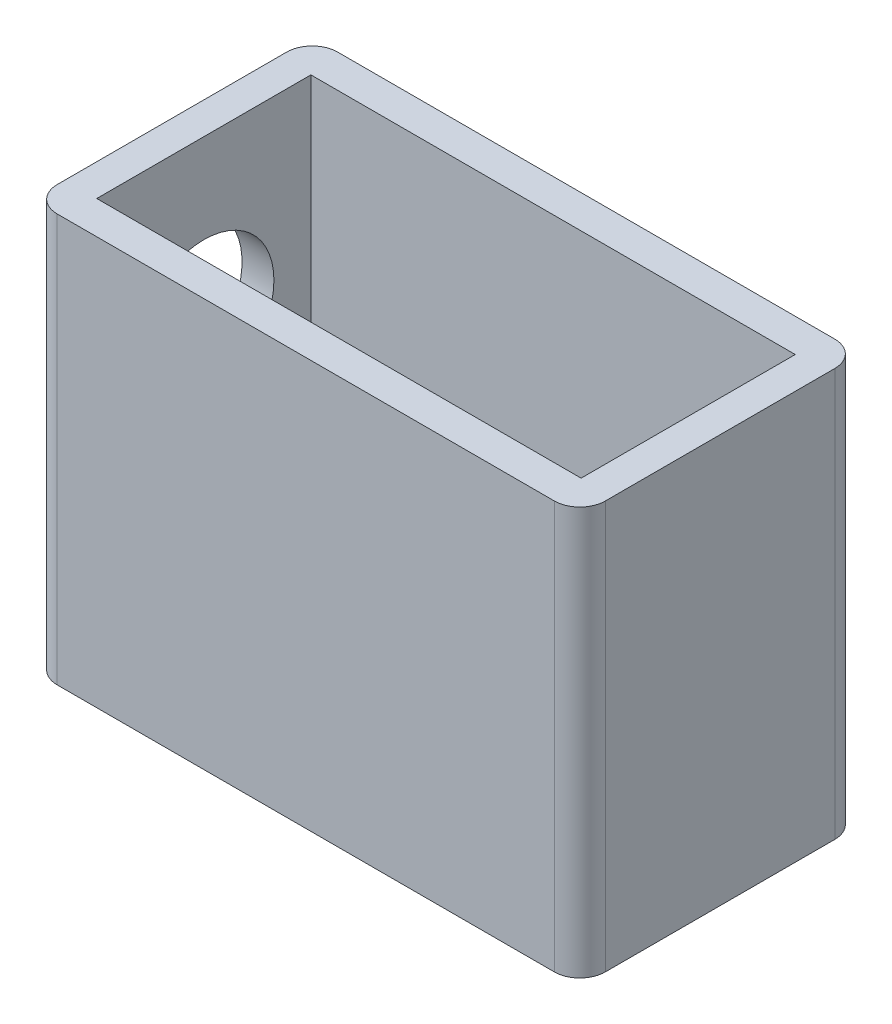
ISO-10303-21;
HEADER;
FILE_DESCRIPTION(('STEP AP214'),'2;1');
FILE_NAME('part.step','',(''),(''),'','','');
FILE_SCHEMA(('AUTOMOTIVE_DESIGN { 1 0 10303 214 1 1 1 1 }'));
ENDSEC;
DATA;
#1=APPLICATION_CONTEXT('core data for automotive mechanical design processes');
#2=APPLICATION_PROTOCOL_DEFINITION('international standard','automotive_design',2000,#1);
#3=PRODUCT_CONTEXT('',#1,'mechanical');
#4=PRODUCT('Part','Part','',(#3));
#5=PRODUCT_RELATED_PRODUCT_CATEGORY('part','',(#4));
#6=PRODUCT_DEFINITION_FORMATION('','',#4);
#7=PRODUCT_DEFINITION_CONTEXT('part definition',#1,'design');
#8=PRODUCT_DEFINITION('design','',#6,#7);
#9=PRODUCT_DEFINITION_SHAPE('','',#8);
#10=(LENGTH_UNIT() NAMED_UNIT(*) SI_UNIT(.MILLI.,.METRE.));
#11=(NAMED_UNIT(*) PLANE_ANGLE_UNIT() SI_UNIT($,.RADIAN.));
#12=(NAMED_UNIT(*) SI_UNIT($,.STERADIAN.) SOLID_ANGLE_UNIT());
#13=UNCERTAINTY_MEASURE_WITH_UNIT(LENGTH_MEASURE(1.E-05),#10,'distance_accuracy_value','');
#14=(GEOMETRIC_REPRESENTATION_CONTEXT(3) GLOBAL_UNCERTAINTY_ASSIGNED_CONTEXT((#13)) GLOBAL_UNIT_ASSIGNED_CONTEXT((#10,
#11,#12)) REPRESENTATION_CONTEXT('',''));
#15=CARTESIAN_POINT('',(0.,0.,0.));
#16=DIRECTION('',(0.,0.,1.));
#17=DIRECTION('',(1.,0.,0.));
#18=AXIS2_PLACEMENT_3D('',#15,#16,#17);
#19=CARTESIAN_POINT('',(-17.8,0.6,-7.2));
#20=DIRECTION('',(-1.,0.,0.));
#21=DIRECTION('',(0.,0.,1.));
#22=AXIS2_PLACEMENT_3D('',#19,#20,#21);
#23=PLANE('',#22);
#24=DIRECTION('',(0.,0.,1.));
#25=VECTOR('',#24,1.);
#26=CARTESIAN_POINT('',(-17.8,2.,-7.2));
#27=LINE('',#26,#25);
#28=CARTESIAN_POINT('',(-17.8,2.,-7.2));
#29=VERTEX_POINT('',#28);
#30=CARTESIAN_POINT('',(-17.8,2.,8.));
#31=VERTEX_POINT('',#30);
#32=EDGE_CURVE('E429',#29,#31,#27,.T.);
#33=ORIENTED_EDGE('',*,*,#32,.T.);
#34=DIRECTION('',(0.,1.,0.));
#35=VECTOR('',#34,1.);
#36=CARTESIAN_POINT('',(-17.8,0.6,8.));
#37=LINE('',#36,#35);
#38=CARTESIAN_POINT('',(-17.8,0.6,8.));
#39=VERTEX_POINT('',#38);
#40=EDGE_CURVE('E428',#39,#31,#37,.T.);
#41=ORIENTED_EDGE('',*,*,#40,.F.);
#42=DIRECTION('',(0.,0.,1.));
#43=VECTOR('',#42,1.);
#44=CARTESIAN_POINT('',(-17.8,0.6,-7.2));
#45=LINE('',#44,#43);
#46=CARTESIAN_POINT('',(-17.8,0.6,-7.2));
#47=VERTEX_POINT('',#46);
#48=EDGE_CURVE('E411',#47,#39,#45,.T.);
#49=ORIENTED_EDGE('',*,*,#48,.F.);
#50=DIRECTION('',(0.,1.,0.));
#51=VECTOR('',#50,1.);
#52=CARTESIAN_POINT('',(-17.8,0.6,-7.2));
#53=LINE('',#52,#51);
#54=EDGE_CURVE('E440',#47,#29,#53,.T.);
#55=ORIENTED_EDGE('',*,*,#54,.T.);
#56=EDGE_LOOP('',(#33,#41,#49,#55));
#57=FACE_BOUND('',#56,.T.);
#58=ADVANCED_FACE('F48',(#57),#23,.F.);
#59=CARTESIAN_POINT('',(-17.8,0.6,8.));
#60=DIRECTION('',(0.,0.,1.));
#61=DIRECTION('',(1.,0.,0.));
#62=AXIS2_PLACEMENT_3D('',#59,#60,#61);
#63=PLANE('',#62);
#64=DIRECTION('',(-1.,0.,0.));
#65=VECTOR('',#64,1.);
#66=CARTESIAN_POINT('',(-17.8,2.,8.));
#67=LINE('',#66,#65);
#68=CARTESIAN_POINT('',(17.8,2.,7.99999999999999));
#69=VERTEX_POINT('',#68);
#70=CARTESIAN_POINT('',(2.00000000000001,2.,8.));
#71=VERTEX_POINT('',#70);
#72=EDGE_CURVE('E257',#69,#71,#67,.T.);
#73=ORIENTED_EDGE('',*,*,#72,.F.);
#74=DIRECTION('',(0.,1.,0.));
#75=VECTOR('',#74,1.);
#76=CARTESIAN_POINT('',(17.8,0.6,8.));
#77=LINE('',#76,#75);
#78=CARTESIAN_POINT('',(17.8,0.6,8.));
#79=VERTEX_POINT('',#78);
#80=EDGE_CURVE('E459',#79,#69,#77,.T.);
#81=ORIENTED_EDGE('',*,*,#80,.F.);
#82=DIRECTION('',(1.,0.,0.));
#83=VECTOR('',#82,1.);
#84=CARTESIAN_POINT('',(2.00000000000001,0.6,8.));
#85=LINE('',#84,#83);
#86=CARTESIAN_POINT('',(2.00000000000001,0.6,8.));
#87=VERTEX_POINT('',#86);
#88=EDGE_CURVE('E487',#87,#79,#85,.T.);
#89=ORIENTED_EDGE('',*,*,#88,.F.);
#90=DIRECTION('',(0.,1.,0.));
#91=VECTOR('',#90,1.);
#92=CARTESIAN_POINT('',(2.00000000000001,0.6,8.));
#93=LINE('',#92,#91);
#94=EDGE_CURVE('E454',#87,#71,#93,.T.);
#95=ORIENTED_EDGE('',*,*,#94,.T.);
#96=EDGE_LOOP('',(#73,#81,#89,#95));
#97=FACE_BOUND('',#96,.T.);
#98=ADVANCED_FACE('F584',(#97),#63,.F.);
#99=CARTESIAN_POINT('',(1.00000000000001,2.,8.));
#100=VERTEX_POINT('',#99);
#101=EDGE_CURVE('E291',#100,#31,#67,.T.);
#102=ORIENTED_EDGE('',*,*,#101,.F.);
#103=DIRECTION('',(0.,1.,0.));
#104=VECTOR('',#103,1.);
#105=CARTESIAN_POINT('',(1.00000000000001,0.6,8.));
#106=LINE('',#105,#104);
#107=CARTESIAN_POINT('',(1.00000000000001,0.6,8.));
#108=VERTEX_POINT('',#107);
#109=EDGE_CURVE('E447',#108,#100,#106,.T.);
#110=ORIENTED_EDGE('',*,*,#109,.F.);
#111=DIRECTION('',(1.,0.,0.));
#112=VECTOR('',#111,1.);
#113=CARTESIAN_POINT('',(-17.8,0.6,8.));
#114=LINE('',#113,#112);
#115=EDGE_CURVE('E415',#39,#108,#114,.T.);
#116=ORIENTED_EDGE('',*,*,#115,.F.);
#117=ORIENTED_EDGE('',*,*,#40,.T.);
#118=EDGE_LOOP('',(#102,#110,#116,#117));
#119=FACE_BOUND('',#118,.T.);
#120=ADVANCED_FACE('F591',(#119),#63,.F.);
#121=CARTESIAN_POINT('',(0.,32.,0.));
#122=DIRECTION('',(0.,1.,0.));
#123=DIRECTION('',(0.,0.,1.));
#124=AXIS2_PLACEMENT_3D('',#121,#122,#123);
#125=PLANE('',#124);
#126=DIRECTION('',(0.,0.,-1.));
#127=VECTOR('',#126,1.);
#128=CARTESIAN_POINT('',(21.5,32.,0.));
#129=LINE('',#128,#127);
#130=CARTESIAN_POINT('',(21.5,32.,8.99999999999999));
#131=VERTEX_POINT('',#130);
#132=CARTESIAN_POINT('',(21.5,32.,-9.00000000000001));
#133=VERTEX_POINT('',#132);
#134=EDGE_CURVE('E292',#131,#133,#129,.T.);
#135=ORIENTED_EDGE('',*,*,#134,.T.);
#136=CARTESIAN_POINT('',(19.5,32.,-9.00000000000001));
#137=DIRECTION('',(0.,1.,0.));
#138=DIRECTION('',(0.,0.,1.));
#139=AXIS2_PLACEMENT_3D('',#136,#137,#138);
#140=CIRCLE('',#139,2.);
#141=CARTESIAN_POINT('',(19.5,32.,-11.));
#142=VERTEX_POINT('',#141);
#143=EDGE_CURVE('E296',#133,#142,#140,.T.);
#144=ORIENTED_EDGE('',*,*,#143,.T.);
#145=DIRECTION('',(-1.,0.,0.));
#146=VECTOR('',#145,1.);
#147=CARTESIAN_POINT('',(0.,32.,-11.));
#148=LINE('',#147,#146);
#149=CARTESIAN_POINT('',(-19.5,32.,-11.));
#150=VERTEX_POINT('',#149);
#151=EDGE_CURVE('E300',#142,#150,#148,.T.);
#152=ORIENTED_EDGE('',*,*,#151,.T.);
#153=CARTESIAN_POINT('',(-19.5,32.,-9.));
#154=DIRECTION('',(0.,1.,0.));
#155=DIRECTION('',(0.,0.,1.));
#156=AXIS2_PLACEMENT_3D('',#153,#154,#155);
#157=CIRCLE('',#156,2.);
#158=CARTESIAN_POINT('',(-21.5,32.,-9.));
#159=VERTEX_POINT('',#158);
#160=EDGE_CURVE('E304',#150,#159,#157,.T.);
#161=ORIENTED_EDGE('',*,*,#160,.T.);
#162=DIRECTION('',(0.,0.,1.));
#163=VECTOR('',#162,1.);
#164=CARTESIAN_POINT('',(-21.5,32.,0.));
#165=LINE('',#164,#163);
#166=CARTESIAN_POINT('',(-21.5,32.,9.));
#167=VERTEX_POINT('',#166);
#168=EDGE_CURVE('E308',#159,#167,#165,.T.);
#169=ORIENTED_EDGE('',*,*,#168,.T.);
#170=CARTESIAN_POINT('',(-19.5,32.,9.));
#171=DIRECTION('',(0.,1.,0.));
#172=DIRECTION('',(0.,0.,1.));
#173=AXIS2_PLACEMENT_3D('',#170,#171,#172);
#174=CIRCLE('',#173,2.);
#175=CARTESIAN_POINT('',(-19.5,32.,11.));
#176=VERTEX_POINT('',#175);
#177=EDGE_CURVE('E312',#167,#176,#174,.T.);
#178=ORIENTED_EDGE('',*,*,#177,.T.);
#179=DIRECTION('',(1.,0.,0.));
#180=VECTOR('',#179,1.);
#181=CARTESIAN_POINT('',(0.,32.,11.));
#182=LINE('',#181,#180);
#183=CARTESIAN_POINT('',(19.5,32.,11.));
#184=VERTEX_POINT('',#183);
#185=EDGE_CURVE('E316',#176,#184,#182,.T.);
#186=ORIENTED_EDGE('',*,*,#185,.T.);
#187=CARTESIAN_POINT('',(19.5,32.,8.99999999999999));
#188=DIRECTION('',(0.,1.,0.));
#189=DIRECTION('',(0.,0.,1.));
#190=AXIS2_PLACEMENT_3D('',#187,#188,#189);
#191=CIRCLE('',#190,2.);
#192=EDGE_CURVE('E320',#184,#131,#191,.T.);
#193=ORIENTED_EDGE('',*,*,#192,.T.);
#194=EDGE_LOOP('',(#135,#144,#152,#161,#169,#178,#186,#193));
#195=FACE_BOUND('',#194,.T.);
#196=DIRECTION('',(1.,0.,0.));
#197=VECTOR('',#196,1.);
#198=CARTESIAN_POINT('',(19.,32.,8.4));
#199=LINE('',#198,#197);
#200=CARTESIAN_POINT('',(-19.,32.,8.4));
#201=VERTEX_POINT('',#200);
#202=CARTESIAN_POINT('',(19.,32.,8.4));
#203=VERTEX_POINT('',#202);
#204=EDGE_CURVE('E248',#201,#203,#199,.T.);
#205=ORIENTED_EDGE('',*,*,#204,.F.);
#206=DIRECTION('',(0.,0.,1.));
#207=VECTOR('',#206,1.);
#208=CARTESIAN_POINT('',(-19.,32.,8.4));
#209=LINE('',#208,#207);
#210=CARTESIAN_POINT('',(-19.,32.,-8.4));
#211=VERTEX_POINT('',#210);
#212=EDGE_CURVE('E236',#211,#201,#209,.T.);
#213=ORIENTED_EDGE('',*,*,#212,.F.);
#214=DIRECTION('',(-1.,0.,0.));
#215=VECTOR('',#214,1.);
#216=CARTESIAN_POINT('',(19.,32.,-8.4));
#217=LINE('',#216,#215);
#218=CARTESIAN_POINT('',(19.,32.,-8.4));
#219=VERTEX_POINT('',#218);
#220=EDGE_CURVE('E266',#219,#211,#217,.T.);
#221=ORIENTED_EDGE('',*,*,#220,.F.);
#222=DIRECTION('',(0.,0.,-1.));
#223=VECTOR('',#222,1.);
#224=CARTESIAN_POINT('',(19.,32.,8.4));
#225=LINE('',#224,#223);
#226=EDGE_CURVE('E262',#203,#219,#225,.T.);
#227=ORIENTED_EDGE('',*,*,#226,.F.);
#228=EDGE_LOOP('',(#205,#213,#221,#227));
#229=FACE_BOUND('',#228,.T.);
#230=ADVANCED_FACE('F261',(#195,#229),#125,.T.);
#231=CARTESIAN_POINT('',(19.5,2.,-9.00000000000001));
#232=DIRECTION('',(0.,-1.,0.));
#233=DIRECTION('',(0.,0.,-1.));
#234=AXIS2_PLACEMENT_3D('',#231,#232,#233);
#235=PLANE('',#234);
#236=DIRECTION('',(0.,0.,-1.));
#237=VECTOR('',#236,1.);
#238=CARTESIAN_POINT('',(1.,2.,-7.2));
#239=LINE('',#238,#237);
#240=CARTESIAN_POINT('',(1.,2.,-7.2));
#241=VERTEX_POINT('',#240);
#242=EDGE_CURVE('E432',#100,#241,#239,.T.);
#243=ORIENTED_EDGE('',*,*,#242,.F.);
#244=ORIENTED_EDGE('',*,*,#101,.T.);
#245=ORIENTED_EDGE('',*,*,#32,.F.);
#246=DIRECTION('',(-1.,0.,0.));
#247=VECTOR('',#246,1.);
#248=CARTESIAN_POINT('',(-17.8,2.,-7.2));
#249=LINE('',#248,#247);
#250=EDGE_CURVE('E416',#241,#29,#249,.T.);
#251=ORIENTED_EDGE('',*,*,#250,.F.);
#252=EDGE_LOOP('',(#243,#244,#245,#251));
#253=FACE_BOUND('',#252,.T.);
#254=ORIENTED_EDGE('',*,*,#72,.T.);
#255=DIRECTION('',(0.,0.,1.));
#256=VECTOR('',#255,1.);
#257=CARTESIAN_POINT('',(2.,2.,-7.8));
#258=LINE('',#257,#256);
#259=CARTESIAN_POINT('',(2.,2.,-7.8));
#260=VERTEX_POINT('',#259);
#261=EDGE_CURVE('E433',#260,#71,#258,.T.);
#262=ORIENTED_EDGE('',*,*,#261,.F.);
#263=DIRECTION('',(-1.,0.,0.));
#264=VECTOR('',#263,1.);
#265=CARTESIAN_POINT('',(2.,2.,-7.8));
#266=LINE('',#265,#264);
#267=CARTESIAN_POINT('',(17.8,2.,-7.8));
#268=VERTEX_POINT('',#267);
#269=EDGE_CURVE('E469',#268,#260,#266,.T.);
#270=ORIENTED_EDGE('',*,*,#269,.F.);
#271=DIRECTION('',(0.,0.,-1.));
#272=VECTOR('',#271,1.);
#273=CARTESIAN_POINT('',(17.8,2.,-7.8));
#274=LINE('',#273,#272);
#275=EDGE_CURVE('E473',#69,#268,#274,.T.);
#276=ORIENTED_EDGE('',*,*,#275,.F.);
#277=EDGE_LOOP('',(#254,#262,#270,#276));
#278=FACE_BOUND('',#277,.T.);
#279=DIRECTION('',(0.,0.,1.));
#280=VECTOR('',#279,1.);
#281=CARTESIAN_POINT('',(-19.,2.,8.4));
#282=LINE('',#281,#280);
#283=CARTESIAN_POINT('',(-19.,2.,-8.4));
#284=VERTEX_POINT('',#283);
#285=CARTESIAN_POINT('',(-19.,2.,8.4));
#286=VERTEX_POINT('',#285);
#287=EDGE_CURVE('E272',#284,#286,#282,.T.);
#288=ORIENTED_EDGE('',*,*,#287,.T.);
#289=DIRECTION('',(1.,0.,0.));
#290=VECTOR('',#289,1.);
#291=CARTESIAN_POINT('',(19.,2.,8.4));
#292=LINE('',#291,#290);
#293=CARTESIAN_POINT('',(19.,2.,8.4));
#294=VERTEX_POINT('',#293);
#295=EDGE_CURVE('E255',#286,#294,#292,.T.);
#296=ORIENTED_EDGE('',*,*,#295,.T.);
#297=DIRECTION('',(0.,0.,-1.));
#298=VECTOR('',#297,1.);
#299=CARTESIAN_POINT('',(19.,2.,8.4));
#300=LINE('',#299,#298);
#301=CARTESIAN_POINT('',(19.,2.,-8.4));
#302=VERTEX_POINT('',#301);
#303=EDGE_CURVE('E278',#294,#302,#300,.T.);
#304=ORIENTED_EDGE('',*,*,#303,.T.);
#305=DIRECTION('',(-1.,0.,0.));
#306=VECTOR('',#305,1.);
#307=CARTESIAN_POINT('',(19.,2.,-8.4));
#308=LINE('',#307,#306);
#309=EDGE_CURVE('E249',#302,#284,#308,.T.);
#310=ORIENTED_EDGE('',*,*,#309,.T.);
#311=EDGE_LOOP('',(#288,#296,#304,#310));
#312=FACE_BOUND('',#311,.T.);
#313=ADVANCED_FACE('F582',(#253,#278,#312),#235,.F.);
#314=CARTESIAN_POINT('',(19.5,2.,-9.00000000000001));
#315=DIRECTION('',(0.,-1.,0.));
#316=DIRECTION('',(0.,0.,-1.));
#317=AXIS2_PLACEMENT_3D('',#314,#315,#316);
#318=CYLINDRICAL_SURFACE('',#317,2.);
#319=CARTESIAN_POINT('',(19.5,0.,-9.00000000000001));
#320=DIRECTION('',(0.,1.,0.));
#321=DIRECTION('',(0.,0.,-1.));
#322=AXIS2_PLACEMENT_3D('',#319,#320,#321);
#323=CIRCLE('',#322,2.);
#324=CARTESIAN_POINT('',(21.5,0.,-9.00000000000001));
#325=VERTEX_POINT('',#324);
#326=CARTESIAN_POINT('',(19.5,0.,-11.));
#327=VERTEX_POINT('',#326);
#328=EDGE_CURVE('E443',#325,#327,#323,.T.);
#329=ORIENTED_EDGE('',*,*,#328,.T.);
#330=DIRECTION('',(0.,-1.,0.));
#331=VECTOR('',#330,1.);
#332=CARTESIAN_POINT('',(19.5,2.,-11.));
#333=LINE('',#332,#331);
#334=EDGE_CURVE('E11',#142,#327,#333,.T.);
#335=ORIENTED_EDGE('',*,*,#334,.F.);
#336=ORIENTED_EDGE('',*,*,#143,.F.);
#337=DIRECTION('',(0.,-1.,0.));
#338=VECTOR('',#337,1.);
#339=CARTESIAN_POINT('',(21.5,2.,-9.00000000000001));
#340=LINE('',#339,#338);
#341=EDGE_CURVE('E518',#133,#325,#340,.T.);
#342=ORIENTED_EDGE('',*,*,#341,.T.);
#343=EDGE_LOOP('',(#329,#335,#336,#342));
#344=FACE_BOUND('',#343,.T.);
#345=ADVANCED_FACE('F50',(#344),#318,.T.);
#346=CARTESIAN_POINT('',(19.5,2.,-11.));
#347=DIRECTION('',(0.,0.,1.));
#348=DIRECTION('',(1.,0.,0.));
#349=AXIS2_PLACEMENT_3D('',#346,#347,#348);
#350=PLANE('',#349);
#351=DIRECTION('',(-1.,0.,0.));
#352=VECTOR('',#351,1.);
#353=CARTESIAN_POINT('',(19.5,0.,-11.));
#354=LINE('',#353,#352);
#355=CARTESIAN_POINT('',(-19.5,0.,-11.));
#356=VERTEX_POINT('',#355);
#357=EDGE_CURVE('E497',#327,#356,#354,.T.);
#358=ORIENTED_EDGE('',*,*,#357,.T.);
#359=DIRECTION('',(0.,-1.,0.));
#360=VECTOR('',#359,1.);
#361=CARTESIAN_POINT('',(-19.5,2.,-11.));
#362=LINE('',#361,#360);
#363=EDGE_CURVE('E57',#150,#356,#362,.T.);
#364=ORIENTED_EDGE('',*,*,#363,.F.);
#365=ORIENTED_EDGE('',*,*,#151,.F.);
#366=ORIENTED_EDGE('',*,*,#334,.T.);
#367=EDGE_LOOP('',(#358,#364,#365,#366));
#368=FACE_BOUND('',#367,.T.);
#369=ADVANCED_FACE('F575',(#368),#350,.F.);
#370=CARTESIAN_POINT('',(-19.5,2.,-9.));
#371=DIRECTION('',(0.,-1.,0.));
#372=DIRECTION('',(0.,0.,-1.));
#373=AXIS2_PLACEMENT_3D('',#370,#371,#372);
#374=CYLINDRICAL_SURFACE('',#373,2.);
#375=CARTESIAN_POINT('',(-19.5,0.,-9.));
#376=DIRECTION('',(0.,1.,0.));
#377=DIRECTION('',(0.,0.,-1.));
#378=AXIS2_PLACEMENT_3D('',#375,#376,#377);
#379=CIRCLE('',#378,2.);
#380=CARTESIAN_POINT('',(-21.5,0.,-9.));
#381=VERTEX_POINT('',#380);
#382=EDGE_CURVE('E500',#356,#381,#379,.T.);
#383=ORIENTED_EDGE('',*,*,#382,.T.);
#384=DIRECTION('',(0.,-1.,0.));
#385=VECTOR('',#384,1.);
#386=CARTESIAN_POINT('',(-21.5,2.,-9.));
#387=LINE('',#386,#385);
#388=EDGE_CURVE('E538',#159,#381,#387,.T.);
#389=ORIENTED_EDGE('',*,*,#388,.F.);
#390=ORIENTED_EDGE('',*,*,#160,.F.);
#391=ORIENTED_EDGE('',*,*,#363,.T.);
#392=EDGE_LOOP('',(#383,#389,#390,#391));
#393=FACE_BOUND('',#392,.T.);
#394=ADVANCED_FACE('F546',(#393),#374,.T.);
#395=CARTESIAN_POINT('',(-21.5,2.,9.));
#396=DIRECTION('',(1.,0.,0.));
#397=DIRECTION('',(0.,0.,-1.));
#398=AXIS2_PLACEMENT_3D('',#395,#396,#397);
#399=PLANE('',#398);
#400=CARTESIAN_POINT('',(-21.5,19.5,0.));
#401=DIRECTION('',(-1.,0.,0.));
#402=DIRECTION('',(0.,0.,1.));
#403=AXIS2_PLACEMENT_3D('',#400,#401,#402);
#404=CIRCLE('',#403,5.5);
#405=CARTESIAN_POINT('',(-21.5,19.5,5.5));
#406=VERTEX_POINT('',#405);
#407=EDGE_CURVE('E275',#406,#406,#404,.T.);
#408=ORIENTED_EDGE('',*,*,#407,.F.);
#409=EDGE_LOOP('',(#408));
#410=FACE_BOUND('',#409,.T.);
#411=DIRECTION('',(0.,0.,1.));
#412=VECTOR('',#411,1.);
#413=CARTESIAN_POINT('',(-21.5,0.,9.));
#414=LINE('',#413,#412);
#415=CARTESIAN_POINT('',(-21.5,0.,9.));
#416=VERTEX_POINT('',#415);
#417=EDGE_CURVE('E503',#381,#416,#414,.T.);
#418=ORIENTED_EDGE('',*,*,#417,.T.);
#419=DIRECTION('',(0.,-1.,0.));
#420=VECTOR('',#419,1.);
#421=CARTESIAN_POINT('',(-21.5,2.,9.));
#422=LINE('',#421,#420);
#423=EDGE_CURVE('E534',#167,#416,#422,.T.);
#424=ORIENTED_EDGE('',*,*,#423,.F.);
#425=ORIENTED_EDGE('',*,*,#168,.F.);
#426=ORIENTED_EDGE('',*,*,#388,.T.);
#427=EDGE_LOOP('',(#418,#424,#425,#426));
#428=FACE_BOUND('',#427,.T.);
#429=ADVANCED_FACE('F556',(#410,#428),#399,.F.);
#430=CARTESIAN_POINT('',(-19.5,2.,9.));
#431=DIRECTION('',(0.,-1.,0.));
#432=DIRECTION('',(0.,0.,-1.));
#433=AXIS2_PLACEMENT_3D('',#430,#431,#432);
#434=CYLINDRICAL_SURFACE('',#433,2.);
#435=CARTESIAN_POINT('',(-19.5,0.,9.));
#436=DIRECTION('',(0.,1.,0.));
#437=DIRECTION('',(0.,0.,-1.));
#438=AXIS2_PLACEMENT_3D('',#435,#436,#437);
#439=CIRCLE('',#438,2.);
#440=CARTESIAN_POINT('',(-19.5,0.,11.));
#441=VERTEX_POINT('',#440);
#442=EDGE_CURVE('E506',#416,#441,#439,.T.);
#443=ORIENTED_EDGE('',*,*,#442,.T.);
#444=DIRECTION('',(0.,-1.,0.));
#445=VECTOR('',#444,1.);
#446=CARTESIAN_POINT('',(-19.5,2.,11.));
#447=LINE('',#446,#445);
#448=EDGE_CURVE('E530',#176,#441,#447,.T.);
#449=ORIENTED_EDGE('',*,*,#448,.F.);
#450=ORIENTED_EDGE('',*,*,#177,.F.);
#451=ORIENTED_EDGE('',*,*,#423,.T.);
#452=EDGE_LOOP('',(#443,#449,#450,#451));
#453=FACE_BOUND('',#452,.T.);
#454=ADVANCED_FACE('F560',(#453),#434,.T.);
#455=CARTESIAN_POINT('',(19.5,2.,11.));
#456=DIRECTION('',(0.,0.,-1.));
#457=DIRECTION('',(-1.,0.,0.));
#458=AXIS2_PLACEMENT_3D('',#455,#456,#457);
#459=PLANE('',#458);
#460=DIRECTION('',(1.,0.,0.));
#461=VECTOR('',#460,1.);
#462=CARTESIAN_POINT('',(19.5,0.,11.));
#463=LINE('',#462,#461);
#464=CARTESIAN_POINT('',(19.5,0.,11.));
#465=VERTEX_POINT('',#464);
#466=EDGE_CURVE('E509',#441,#465,#463,.T.);
#467=ORIENTED_EDGE('',*,*,#466,.T.);
#468=DIRECTION('',(0.,-1.,0.));
#469=VECTOR('',#468,1.);
#470=CARTESIAN_POINT('',(19.5,2.,11.));
#471=LINE('',#470,#469);
#472=EDGE_CURVE('E526',#184,#465,#471,.T.);
#473=ORIENTED_EDGE('',*,*,#472,.F.);
#474=ORIENTED_EDGE('',*,*,#185,.F.);
#475=ORIENTED_EDGE('',*,*,#448,.T.);
#476=EDGE_LOOP('',(#467,#473,#474,#475));
#477=FACE_BOUND('',#476,.T.);
#478=ADVANCED_FACE('F565',(#477),#459,.F.);
#479=CARTESIAN_POINT('',(19.5,2.,8.99999999999999));
#480=DIRECTION('',(0.,-1.,0.));
#481=DIRECTION('',(0.,0.,-1.));
#482=AXIS2_PLACEMENT_3D('',#479,#480,#481);
#483=CYLINDRICAL_SURFACE('',#482,2.);
#484=CARTESIAN_POINT('',(19.5,0.,8.99999999999999));
#485=DIRECTION('',(0.,1.,0.));
#486=DIRECTION('',(0.,0.,-1.));
#487=AXIS2_PLACEMENT_3D('',#484,#485,#486);
#488=CIRCLE('',#487,2.);
#489=CARTESIAN_POINT('',(21.5,0.,8.99999999999999));
#490=VERTEX_POINT('',#489);
#491=EDGE_CURVE('E512',#465,#490,#488,.T.);
#492=ORIENTED_EDGE('',*,*,#491,.T.);
#493=DIRECTION('',(0.,-1.,0.));
#494=VECTOR('',#493,1.);
#495=CARTESIAN_POINT('',(21.5,2.,8.99999999999999));
#496=LINE('',#495,#494);
#497=EDGE_CURVE('E522',#131,#490,#496,.T.);
#498=ORIENTED_EDGE('',*,*,#497,.F.);
#499=ORIENTED_EDGE('',*,*,#192,.F.);
#500=ORIENTED_EDGE('',*,*,#472,.T.);
#501=EDGE_LOOP('',(#492,#498,#499,#500));
#502=FACE_BOUND('',#501,.T.);
#503=ADVANCED_FACE('F568',(#502),#483,.T.);
#504=CARTESIAN_POINT('',(21.5,2.,8.99999999999999));
#505=DIRECTION('',(-1.,0.,0.));
#506=DIRECTION('',(0.,0.,1.));
#507=AXIS2_PLACEMENT_3D('',#504,#505,#506);
#508=PLANE('',#507);
#509=DIRECTION('',(0.,0.,-1.));
#510=VECTOR('',#509,1.);
#511=CARTESIAN_POINT('',(21.5,0.,8.99999999999999));
#512=LINE('',#511,#510);
#513=EDGE_CURVE('E515',#490,#325,#512,.T.);
#514=ORIENTED_EDGE('',*,*,#513,.T.);
#515=ORIENTED_EDGE('',*,*,#341,.F.);
#516=ORIENTED_EDGE('',*,*,#134,.F.);
#517=ORIENTED_EDGE('',*,*,#497,.T.);
#518=EDGE_LOOP('',(#514,#515,#516,#517));
#519=FACE_BOUND('',#518,.T.);
#520=ADVANCED_FACE('F571',(#519),#508,.F.);
#521=CARTESIAN_POINT('',(19.5,0.,-9.00000000000001));
#522=DIRECTION('',(0.,-1.,0.));
#523=DIRECTION('',(0.,0.,-1.));
#524=AXIS2_PLACEMENT_3D('',#521,#522,#523);
#525=PLANE('',#524);
#526=DIRECTION('',(0.,0.,1.));
#527=VECTOR('',#526,1.);
#528=CARTESIAN_POINT('',(-16.8,0.,-6.2));
#529=LINE('',#528,#527);
#530=CARTESIAN_POINT('',(-16.8,0.,-6.2));
#531=VERTEX_POINT('',#530);
#532=CARTESIAN_POINT('',(-16.8,0.,7.));
#533=VERTEX_POINT('',#532);
#534=EDGE_CURVE('E325',#531,#533,#529,.T.);
#535=ORIENTED_EDGE('',*,*,#534,.T.);
#536=DIRECTION('',(1.,0.,0.));
#537=VECTOR('',#536,1.);
#538=CARTESIAN_POINT('',(-16.8,0.,7.));
#539=LINE('',#538,#537);
#540=CARTESIAN_POINT('',(0.,0.,7.));
#541=VERTEX_POINT('',#540);
#542=EDGE_CURVE('E329',#533,#541,#539,.T.);
#543=ORIENTED_EDGE('',*,*,#542,.T.);
#544=DIRECTION('',(0.,0.,-1.));
#545=VECTOR('',#544,1.);
#546=CARTESIAN_POINT('',(0.,0.,-6.2));
#547=LINE('',#546,#545);
#548=CARTESIAN_POINT('',(0.,0.,-6.2));
#549=VERTEX_POINT('',#548);
#550=EDGE_CURVE('E334',#541,#549,#547,.T.);
#551=ORIENTED_EDGE('',*,*,#550,.T.);
#552=DIRECTION('',(-1.,0.,0.));
#553=VECTOR('',#552,1.);
#554=CARTESIAN_POINT('',(-16.8,0.,-6.2));
#555=LINE('',#554,#553);
#556=EDGE_CURVE('E338',#549,#531,#555,.T.);
#557=ORIENTED_EDGE('',*,*,#556,.T.);
#558=EDGE_LOOP('',(#535,#543,#551,#557));
#559=FACE_BOUND('',#558,.T.);
#560=DIRECTION('',(0.,0.,1.));
#561=VECTOR('',#560,1.);
#562=CARTESIAN_POINT('',(3.,0.,-6.8));
#563=LINE('',#562,#561);
#564=CARTESIAN_POINT('',(3.,0.,-6.8));
#565=VERTEX_POINT('',#564);
#566=CARTESIAN_POINT('',(3.00000000000001,0.,7.));
#567=VERTEX_POINT('',#566);
#568=EDGE_CURVE('E387',#565,#567,#563,.T.);
#569=ORIENTED_EDGE('',*,*,#568,.T.);
#570=DIRECTION('',(1.,0.,0.));
#571=VECTOR('',#570,1.);
#572=CARTESIAN_POINT('',(3.00000000000001,0.,7.));
#573=LINE('',#572,#571);
#574=CARTESIAN_POINT('',(16.8,0.,7.));
#575=VERTEX_POINT('',#574);
#576=EDGE_CURVE('E404',#567,#575,#573,.T.);
#577=ORIENTED_EDGE('',*,*,#576,.T.);
#578=DIRECTION('',(0.,0.,-1.));
#579=VECTOR('',#578,1.);
#580=CARTESIAN_POINT('',(16.8,0.,-6.8));
#581=LINE('',#580,#579);
#582=CARTESIAN_POINT('',(16.8,0.,-6.8));
#583=VERTEX_POINT('',#582);
#584=EDGE_CURVE('E400',#575,#583,#581,.T.);
#585=ORIENTED_EDGE('',*,*,#584,.T.);
#586=DIRECTION('',(-1.,0.,0.));
#587=VECTOR('',#586,1.);
#588=CARTESIAN_POINT('',(3.,0.,-6.8));
#589=LINE('',#588,#587);
#590=EDGE_CURVE('E374',#583,#565,#589,.T.);
#591=ORIENTED_EDGE('',*,*,#590,.T.);
#592=EDGE_LOOP('',(#569,#577,#585,#591));
#593=FACE_BOUND('',#592,.T.);
#594=ORIENTED_EDGE('',*,*,#328,.F.);
#595=ORIENTED_EDGE('',*,*,#513,.F.);
#596=ORIENTED_EDGE('',*,*,#491,.F.);
#597=ORIENTED_EDGE('',*,*,#466,.F.);
#598=ORIENTED_EDGE('',*,*,#442,.F.);
#599=ORIENTED_EDGE('',*,*,#417,.F.);
#600=ORIENTED_EDGE('',*,*,#382,.F.);
#601=ORIENTED_EDGE('',*,*,#357,.F.);
#602=EDGE_LOOP('',(#594,#595,#596,#597,#598,#599,#600,#601));
#603=FACE_BOUND('',#602,.T.);
#604=ADVANCED_FACE('F552',(#559,#593,#603),#525,.T.);
#605=CARTESIAN_POINT('',(2.,0.6,-7.8));
#606=DIRECTION('',(-1.,0.,0.));
#607=DIRECTION('',(0.,0.,1.));
#608=AXIS2_PLACEMENT_3D('',#605,#606,#607);
#609=PLANE('',#608);
#610=ORIENTED_EDGE('',*,*,#261,.T.);
#611=ORIENTED_EDGE('',*,*,#94,.F.);
#612=DIRECTION('',(0.,0.,1.));
#613=VECTOR('',#612,1.);
#614=CARTESIAN_POINT('',(2.,0.6,-7.8));
#615=LINE('',#614,#613);
#616=CARTESIAN_POINT('',(2.,0.6,-7.8));
#617=VERTEX_POINT('',#616);
#618=EDGE_CURVE('E474',#617,#87,#615,.T.);
#619=ORIENTED_EDGE('',*,*,#618,.F.);
#620=DIRECTION('',(0.,1.,0.));
#621=VECTOR('',#620,1.);
#622=CARTESIAN_POINT('',(2.,0.6,-7.8));
#623=LINE('',#622,#621);
#624=EDGE_CURVE('E361',#617,#260,#623,.T.);
#625=ORIENTED_EDGE('',*,*,#624,.T.);
#626=EDGE_LOOP('',(#610,#611,#619,#625));
#627=FACE_BOUND('',#626,.T.);
#628=ADVANCED_FACE('F596',(#627),#609,.F.);
#629=CARTESIAN_POINT('',(2.,0.6,-7.8));
#630=DIRECTION('',(0.,0.,-1.));
#631=DIRECTION('',(-1.,0.,0.));
#632=AXIS2_PLACEMENT_3D('',#629,#630,#631);
#633=PLANE('',#632);
#634=ORIENTED_EDGE('',*,*,#269,.T.);
#635=ORIENTED_EDGE('',*,*,#624,.F.);
#636=DIRECTION('',(-1.,0.,0.));
#637=VECTOR('',#636,1.);
#638=CARTESIAN_POINT('',(2.,0.6,-7.8));
#639=LINE('',#638,#637);
#640=CARTESIAN_POINT('',(17.8,0.6,-7.8));
#641=VERTEX_POINT('',#640);
#642=EDGE_CURVE('E458',#641,#617,#639,.T.);
#643=ORIENTED_EDGE('',*,*,#642,.F.);
#644=DIRECTION('',(0.,1.,0.));
#645=VECTOR('',#644,1.);
#646=CARTESIAN_POINT('',(17.8,0.6,-7.8));
#647=LINE('',#646,#645);
#648=EDGE_CURVE('E463',#641,#268,#647,.T.);
#649=ORIENTED_EDGE('',*,*,#648,.T.);
#650=EDGE_LOOP('',(#634,#635,#643,#649));
#651=FACE_BOUND('',#650,.T.);
#652=ADVANCED_FACE('F599',(#651),#633,.F.);
#653=CARTESIAN_POINT('',(17.8,0.6,-7.8));
#654=DIRECTION('',(1.,0.,0.));
#655=DIRECTION('',(0.,0.,-1.));
#656=AXIS2_PLACEMENT_3D('',#653,#654,#655);
#657=PLANE('',#656);
#658=ORIENTED_EDGE('',*,*,#80,.T.);
#659=ORIENTED_EDGE('',*,*,#275,.T.);
#660=ORIENTED_EDGE('',*,*,#648,.F.);
#661=DIRECTION('',(0.,0.,-1.));
#662=VECTOR('',#661,1.);
#663=CARTESIAN_POINT('',(17.8,0.6,-7.8));
#664=LINE('',#663,#662);
#665=EDGE_CURVE('E483',#79,#641,#664,.T.);
#666=ORIENTED_EDGE('',*,*,#665,.F.);
#667=EDGE_LOOP('',(#658,#659,#660,#666));
#668=FACE_BOUND('',#667,.T.);
#669=ADVANCED_FACE('F601',(#668),#657,.F.);
#670=CARTESIAN_POINT('',(0.,0.6,0.));
#671=DIRECTION('',(0.,1.,0.));
#672=DIRECTION('',(0.,0.,1.));
#673=AXIS2_PLACEMENT_3D('',#670,#671,#672);
#674=PLANE('',#673);
#675=DIRECTION('',(0.,0.,1.));
#676=VECTOR('',#675,1.);
#677=CARTESIAN_POINT('',(3.,0.6,-6.8));
#678=LINE('',#677,#676);
#679=CARTESIAN_POINT('',(3.,0.6,-6.8));
#680=VERTEX_POINT('',#679);
#681=CARTESIAN_POINT('',(3.00000000000001,0.6,7.));
#682=VERTEX_POINT('',#681);
#683=EDGE_CURVE('E348',#680,#682,#678,.T.);
#684=ORIENTED_EDGE('',*,*,#683,.F.);
#685=DIRECTION('',(-1.,0.,0.));
#686=VECTOR('',#685,1.);
#687=CARTESIAN_POINT('',(3.,0.6,-6.8));
#688=LINE('',#687,#686);
#689=CARTESIAN_POINT('',(16.8,0.6,-6.8));
#690=VERTEX_POINT('',#689);
#691=EDGE_CURVE('E383',#690,#680,#688,.T.);
#692=ORIENTED_EDGE('',*,*,#691,.F.);
#693=DIRECTION('',(0.,0.,-1.));
#694=VECTOR('',#693,1.);
#695=CARTESIAN_POINT('',(16.8,0.6,-6.8));
#696=LINE('',#695,#694);
#697=CARTESIAN_POINT('',(16.8,0.6,7.));
#698=VERTEX_POINT('',#697);
#699=EDGE_CURVE('E72',#698,#690,#696,.T.);
#700=ORIENTED_EDGE('',*,*,#699,.F.);
#701=DIRECTION('',(1.,0.,0.));
#702=VECTOR('',#701,1.);
#703=CARTESIAN_POINT('',(3.00000000000001,0.6,7.));
#704=LINE('',#703,#702);
#705=EDGE_CURVE('E390',#682,#698,#704,.T.);
#706=ORIENTED_EDGE('',*,*,#705,.F.);
#707=EDGE_LOOP('',(#684,#692,#700,#706));
#708=FACE_BOUND('',#707,.T.);
#709=ORIENTED_EDGE('',*,*,#618,.T.);
#710=ORIENTED_EDGE('',*,*,#88,.T.);
#711=ORIENTED_EDGE('',*,*,#665,.T.);
#712=ORIENTED_EDGE('',*,*,#642,.T.);
#713=EDGE_LOOP('',(#709,#710,#711,#712));
#714=FACE_BOUND('',#713,.T.);
#715=ADVANCED_FACE('F604',(#708,#714),#674,.T.);
#716=CARTESIAN_POINT('',(-17.8,0.6,-7.2));
#717=DIRECTION('',(0.,0.,-1.));
#718=DIRECTION('',(-1.,0.,0.));
#719=AXIS2_PLACEMENT_3D('',#716,#717,#718);
#720=PLANE('',#719);
#721=ORIENTED_EDGE('',*,*,#250,.T.);
#722=ORIENTED_EDGE('',*,*,#54,.F.);
#723=DIRECTION('',(-1.,0.,0.));
#724=VECTOR('',#723,1.);
#725=CARTESIAN_POINT('',(-17.8,0.6,-7.2));
#726=LINE('',#725,#724);
#727=CARTESIAN_POINT('',(1.,0.6,-7.2));
#728=VERTEX_POINT('',#727);
#729=EDGE_CURVE('E424',#728,#47,#726,.T.);
#730=ORIENTED_EDGE('',*,*,#729,.F.);
#731=DIRECTION('',(0.,1.,0.));
#732=VECTOR('',#731,1.);
#733=CARTESIAN_POINT('',(1.,0.6,-7.2));
#734=LINE('',#733,#732);
#735=EDGE_CURVE('E444',#728,#241,#734,.T.);
#736=ORIENTED_EDGE('',*,*,#735,.T.);
#737=EDGE_LOOP('',(#721,#722,#730,#736));
#738=FACE_BOUND('',#737,.T.);
#739=ADVANCED_FACE('F611',(#738),#720,.F.);
#740=CARTESIAN_POINT('',(1.,0.6,-7.2));
#741=DIRECTION('',(1.,0.,0.));
#742=DIRECTION('',(0.,0.,-1.));
#743=AXIS2_PLACEMENT_3D('',#740,#741,#742);
#744=PLANE('',#743);
#745=ORIENTED_EDGE('',*,*,#242,.T.);
#746=ORIENTED_EDGE('',*,*,#735,.F.);
#747=DIRECTION('',(0.,0.,-1.));
#748=VECTOR('',#747,1.);
#749=CARTESIAN_POINT('',(1.,0.6,-7.2));
#750=LINE('',#749,#748);
#751=EDGE_CURVE('E420',#108,#728,#750,.T.);
#752=ORIENTED_EDGE('',*,*,#751,.F.);
#753=ORIENTED_EDGE('',*,*,#109,.T.);
#754=EDGE_LOOP('',(#745,#746,#752,#753));
#755=FACE_BOUND('',#754,.T.);
#756=ADVANCED_FACE('F694',(#755),#744,.F.);
#757=CARTESIAN_POINT('',(0.,0.6,0.));
#758=DIRECTION('',(0.,1.,0.));
#759=DIRECTION('',(0.,0.,1.));
#760=AXIS2_PLACEMENT_3D('',#757,#758,#759);
#761=PLANE('',#760);
#762=DIRECTION('',(0.,0.,1.));
#763=VECTOR('',#762,1.);
#764=CARTESIAN_POINT('',(-16.8,0.6,-6.2));
#765=LINE('',#764,#763);
#766=CARTESIAN_POINT('',(-16.8,0.6,-6.2));
#767=VERTEX_POINT('',#766);
#768=CARTESIAN_POINT('',(-16.8,0.6,7.));
#769=VERTEX_POINT('',#768);
#770=EDGE_CURVE('E343',#767,#769,#765,.T.);
#771=ORIENTED_EDGE('',*,*,#770,.F.);
#772=DIRECTION('',(-1.,0.,0.));
#773=VECTOR('',#772,1.);
#774=CARTESIAN_POINT('',(-16.8,0.6,-6.2));
#775=LINE('',#774,#773);
#776=CARTESIAN_POINT('',(0.,0.6,-6.2));
#777=VERTEX_POINT('',#776);
#778=EDGE_CURVE('E330',#777,#767,#775,.T.);
#779=ORIENTED_EDGE('',*,*,#778,.F.);
#780=DIRECTION('',(0.,0.,-1.));
#781=VECTOR('',#780,1.);
#782=CARTESIAN_POINT('',(0.,0.6,-6.2));
#783=LINE('',#782,#781);
#784=CARTESIAN_POINT('',(0.,0.6,7.));
#785=VERTEX_POINT('',#784);
#786=EDGE_CURVE('E352',#785,#777,#783,.T.);
#787=ORIENTED_EDGE('',*,*,#786,.F.);
#788=DIRECTION('',(1.,0.,0.));
#789=VECTOR('',#788,1.);
#790=CARTESIAN_POINT('',(-16.8,0.6,7.));
#791=LINE('',#790,#789);
#792=EDGE_CURVE('E347',#769,#785,#791,.T.);
#793=ORIENTED_EDGE('',*,*,#792,.F.);
#794=EDGE_LOOP('',(#771,#779,#787,#793));
#795=FACE_BOUND('',#794,.T.);
#796=ORIENTED_EDGE('',*,*,#48,.T.);
#797=ORIENTED_EDGE('',*,*,#115,.T.);
#798=ORIENTED_EDGE('',*,*,#751,.T.);
#799=ORIENTED_EDGE('',*,*,#729,.T.);
#800=EDGE_LOOP('',(#796,#797,#798,#799));
#801=FACE_BOUND('',#800,.T.);
#802=ADVANCED_FACE('F681',(#795,#801),#761,.T.);
#803=CARTESIAN_POINT('',(3.,0.,-6.8));
#804=DIRECTION('',(-1.,0.,0.));
#805=DIRECTION('',(0.,0.,1.));
#806=AXIS2_PLACEMENT_3D('',#803,#804,#805);
#807=PLANE('',#806);
#808=ORIENTED_EDGE('',*,*,#683,.T.);
#809=DIRECTION('',(0.,1.,0.));
#810=VECTOR('',#809,1.);
#811=CARTESIAN_POINT('',(3.00000000000001,0.,7.));
#812=LINE('',#811,#810);
#813=EDGE_CURVE('E371',#567,#682,#812,.T.);
#814=ORIENTED_EDGE('',*,*,#813,.F.);
#815=ORIENTED_EDGE('',*,*,#568,.F.);
#816=DIRECTION('',(0.,1.,0.));
#817=VECTOR('',#816,1.);
#818=CARTESIAN_POINT('',(3.,0.,-6.8));
#819=LINE('',#818,#817);
#820=EDGE_CURVE('E324',#565,#680,#819,.T.);
#821=ORIENTED_EDGE('',*,*,#820,.T.);
#822=EDGE_LOOP('',(#808,#814,#815,#821));
#823=FACE_BOUND('',#822,.T.);
#824=ADVANCED_FACE('F677',(#823),#807,.F.);
#825=CARTESIAN_POINT('',(3.,0.,-6.8));
#826=DIRECTION('',(0.,0.,-1.));
#827=DIRECTION('',(-1.,0.,0.));
#828=AXIS2_PLACEMENT_3D('',#825,#826,#827);
#829=PLANE('',#828);
#830=ORIENTED_EDGE('',*,*,#691,.T.);
#831=ORIENTED_EDGE('',*,*,#820,.F.);
#832=ORIENTED_EDGE('',*,*,#590,.F.);
#833=DIRECTION('',(0.,1.,0.));
#834=VECTOR('',#833,1.);
#835=CARTESIAN_POINT('',(16.8,0.,-6.8));
#836=LINE('',#835,#834);
#837=EDGE_CURVE('E378',#583,#690,#836,.T.);
#838=ORIENTED_EDGE('',*,*,#837,.T.);
#839=EDGE_LOOP('',(#830,#831,#832,#838));
#840=FACE_BOUND('',#839,.T.);
#841=ADVANCED_FACE('F680',(#840),#829,.F.);
#842=CARTESIAN_POINT('',(16.8,0.,-6.8));
#843=DIRECTION('',(1.,0.,0.));
#844=DIRECTION('',(0.,0.,-1.));
#845=AXIS2_PLACEMENT_3D('',#842,#843,#844);
#846=PLANE('',#845);
#847=ORIENTED_EDGE('',*,*,#699,.T.);
#848=ORIENTED_EDGE('',*,*,#837,.F.);
#849=ORIENTED_EDGE('',*,*,#584,.F.);
#850=DIRECTION('',(0.,1.,0.));
#851=VECTOR('',#850,1.);
#852=CARTESIAN_POINT('',(16.8,0.,7.));
#853=LINE('',#852,#851);
#854=EDGE_CURVE('E375',#575,#698,#853,.T.);
#855=ORIENTED_EDGE('',*,*,#854,.T.);
#856=EDGE_LOOP('',(#847,#848,#849,#855));
#857=FACE_BOUND('',#856,.T.);
#858=ADVANCED_FACE('F685',(#857),#846,.F.);
#859=CARTESIAN_POINT('',(3.00000000000001,0.,7.));
#860=DIRECTION('',(0.,0.,1.));
#861=DIRECTION('',(1.,0.,0.));
#862=AXIS2_PLACEMENT_3D('',#859,#860,#861);
#863=PLANE('',#862);
#864=ORIENTED_EDGE('',*,*,#705,.T.);
#865=ORIENTED_EDGE('',*,*,#854,.F.);
#866=ORIENTED_EDGE('',*,*,#576,.F.);
#867=ORIENTED_EDGE('',*,*,#813,.T.);
#868=EDGE_LOOP('',(#864,#865,#866,#867));
#869=FACE_BOUND('',#868,.T.);
#870=ADVANCED_FACE('F675',(#869),#863,.F.);
#871=CARTESIAN_POINT('',(-16.8,0.,-6.2));
#872=DIRECTION('',(-1.,0.,0.));
#873=DIRECTION('',(0.,0.,1.));
#874=AXIS2_PLACEMENT_3D('',#871,#872,#873);
#875=PLANE('',#874);
#876=ORIENTED_EDGE('',*,*,#770,.T.);
#877=DIRECTION('',(0.,1.,0.));
#878=VECTOR('',#877,1.);
#879=CARTESIAN_POINT('',(-16.8,0.,7.));
#880=LINE('',#879,#878);
#881=EDGE_CURVE('E342',#533,#769,#880,.T.);
#882=ORIENTED_EDGE('',*,*,#881,.F.);
#883=ORIENTED_EDGE('',*,*,#534,.F.);
#884=DIRECTION('',(0.,1.,0.));
#885=VECTOR('',#884,1.);
#886=CARTESIAN_POINT('',(-16.8,0.,-6.2));
#887=LINE('',#886,#885);
#888=EDGE_CURVE('E358',#531,#767,#887,.T.);
#889=ORIENTED_EDGE('',*,*,#888,.T.);
#890=EDGE_LOOP('',(#876,#882,#883,#889));
#891=FACE_BOUND('',#890,.T.);
#892=ADVANCED_FACE('F665',(#891),#875,.F.);
#893=CARTESIAN_POINT('',(-16.8,0.,-6.2));
#894=DIRECTION('',(0.,0.,-1.));
#895=DIRECTION('',(-1.,0.,0.));
#896=AXIS2_PLACEMENT_3D('',#893,#894,#895);
#897=PLANE('',#896);
#898=ORIENTED_EDGE('',*,*,#778,.T.);
#899=ORIENTED_EDGE('',*,*,#888,.F.);
#900=ORIENTED_EDGE('',*,*,#556,.F.);
#901=DIRECTION('',(0.,1.,0.));
#902=VECTOR('',#901,1.);
#903=CARTESIAN_POINT('',(0.,0.,-6.2));
#904=LINE('',#903,#902);
#905=EDGE_CURVE('E362',#549,#777,#904,.T.);
#906=ORIENTED_EDGE('',*,*,#905,.T.);
#907=EDGE_LOOP('',(#898,#899,#900,#906));
#908=FACE_BOUND('',#907,.T.);
#909=ADVANCED_FACE('F661',(#908),#897,.F.);
#910=CARTESIAN_POINT('',(0.,0.,-6.2));
#911=DIRECTION('',(1.,0.,0.));
#912=DIRECTION('',(0.,0.,-1.));
#913=AXIS2_PLACEMENT_3D('',#910,#911,#912);
#914=PLANE('',#913);
#915=ORIENTED_EDGE('',*,*,#786,.T.);
#916=ORIENTED_EDGE('',*,*,#905,.F.);
#917=ORIENTED_EDGE('',*,*,#550,.F.);
#918=DIRECTION('',(0.,1.,0.));
#919=VECTOR('',#918,1.);
#920=CARTESIAN_POINT('',(0.,0.,7.));
#921=LINE('',#920,#919);
#922=EDGE_CURVE('E366',#541,#785,#921,.T.);
#923=ORIENTED_EDGE('',*,*,#922,.T.);
#924=EDGE_LOOP('',(#915,#916,#917,#923));
#925=FACE_BOUND('',#924,.T.);
#926=ADVANCED_FACE('F664',(#925),#914,.F.);
#927=CARTESIAN_POINT('',(-16.8,0.,7.));
#928=DIRECTION('',(0.,0.,1.));
#929=DIRECTION('',(1.,0.,0.));
#930=AXIS2_PLACEMENT_3D('',#927,#928,#929);
#931=PLANE('',#930);
#932=ORIENTED_EDGE('',*,*,#792,.T.);
#933=ORIENTED_EDGE('',*,*,#922,.F.);
#934=ORIENTED_EDGE('',*,*,#542,.F.);
#935=ORIENTED_EDGE('',*,*,#881,.T.);
#936=EDGE_LOOP('',(#932,#933,#934,#935));
#937=FACE_BOUND('',#936,.T.);
#938=ADVANCED_FACE('F658',(#937),#931,.F.);
#939=CARTESIAN_POINT('',(-19.,32.,8.4));
#940=DIRECTION('',(1.,0.,0.));
#941=DIRECTION('',(0.,0.,-1.));
#942=AXIS2_PLACEMENT_3D('',#939,#940,#941);
#943=PLANE('',#942);
#944=CARTESIAN_POINT('',(-19.,19.5,0.));
#945=DIRECTION('',(1.,0.,0.));
#946=DIRECTION('',(0.,0.,-1.));
#947=AXIS2_PLACEMENT_3D('',#944,#945,#946);
#948=CIRCLE('',#947,5.5);
#949=CARTESIAN_POINT('',(-19.,19.5,-5.5));
#950=VERTEX_POINT('',#949);
#951=EDGE_CURVE('E636',#950,#950,#948,.F.);
#952=ORIENTED_EDGE('',*,*,#951,.T.);
#953=EDGE_LOOP('',(#952));
#954=FACE_BOUND('',#953,.T.);
#955=ORIENTED_EDGE('',*,*,#287,.F.);
#956=DIRECTION('',(0.,-1.,0.));
#957=VECTOR('',#956,1.);
#958=CARTESIAN_POINT('',(-19.,32.,-8.4));
#959=LINE('',#958,#957);
#960=EDGE_CURVE('E243',#211,#284,#959,.T.);
#961=ORIENTED_EDGE('',*,*,#960,.F.);
#962=ORIENTED_EDGE('',*,*,#212,.T.);
#963=DIRECTION('',(0.,-1.,0.));
#964=VECTOR('',#963,1.);
#965=CARTESIAN_POINT('',(-19.,32.,8.4));
#966=LINE('',#965,#964);
#967=EDGE_CURVE('E240',#201,#286,#966,.T.);
#968=ORIENTED_EDGE('',*,*,#967,.T.);
#969=EDGE_LOOP('',(#955,#961,#962,#968));
#970=FACE_BOUND('',#969,.T.);
#971=ADVANCED_FACE('F239',(#954,#970),#943,.T.);
#972=CARTESIAN_POINT('',(19.,32.,8.4));
#973=DIRECTION('',(0.,0.,-1.));
#974=DIRECTION('',(-1.,0.,0.));
#975=AXIS2_PLACEMENT_3D('',#972,#973,#974);
#976=PLANE('',#975);
#977=ORIENTED_EDGE('',*,*,#295,.F.);
#978=ORIENTED_EDGE('',*,*,#967,.F.);
#979=ORIENTED_EDGE('',*,*,#204,.T.);
#980=DIRECTION('',(0.,-1.,0.));
#981=VECTOR('',#980,1.);
#982=CARTESIAN_POINT('',(19.,32.,8.4));
#983=LINE('',#982,#981);
#984=EDGE_CURVE('E258',#203,#294,#983,.T.);
#985=ORIENTED_EDGE('',*,*,#984,.T.);
#986=EDGE_LOOP('',(#977,#978,#979,#985));
#987=FACE_BOUND('',#986,.T.);
#988=ADVANCED_FACE('F252',(#987),#976,.T.);
#989=CARTESIAN_POINT('',(19.,32.,8.4));
#990=DIRECTION('',(-1.,0.,0.));
#991=DIRECTION('',(0.,0.,1.));
#992=AXIS2_PLACEMENT_3D('',#989,#990,#991);
#993=PLANE('',#992);
#994=ORIENTED_EDGE('',*,*,#303,.F.);
#995=ORIENTED_EDGE('',*,*,#984,.F.);
#996=ORIENTED_EDGE('',*,*,#226,.T.);
#997=DIRECTION('',(0.,-1.,0.));
#998=VECTOR('',#997,1.);
#999=CARTESIAN_POINT('',(19.,32.,-8.4));
#1000=LINE('',#999,#998);
#1001=EDGE_CURVE('E64',#219,#302,#1000,.T.);
#1002=ORIENTED_EDGE('',*,*,#1001,.T.);
#1003=EDGE_LOOP('',(#994,#995,#996,#1002));
#1004=FACE_BOUND('',#1003,.T.);
#1005=ADVANCED_FACE('F649',(#1004),#993,.T.);
#1006=CARTESIAN_POINT('',(19.,32.,-8.4));
#1007=DIRECTION('',(0.,0.,1.));
#1008=DIRECTION('',(1.,0.,0.));
#1009=AXIS2_PLACEMENT_3D('',#1006,#1007,#1008);
#1010=PLANE('',#1009);
#1011=ORIENTED_EDGE('',*,*,#309,.F.);
#1012=ORIENTED_EDGE('',*,*,#1001,.F.);
#1013=ORIENTED_EDGE('',*,*,#220,.T.);
#1014=ORIENTED_EDGE('',*,*,#960,.T.);
#1015=EDGE_LOOP('',(#1011,#1012,#1013,#1014));
#1016=FACE_BOUND('',#1015,.T.);
#1017=ADVANCED_FACE('F645',(#1016),#1010,.T.);
#1018=CARTESIAN_POINT('',(21.501,19.5,0.));
#1019=DIRECTION('',(-1.,0.,0.));
#1020=DIRECTION('',(0.,0.,1.));
#1021=AXIS2_PLACEMENT_3D('',#1018,#1019,#1020);
#1022=CYLINDRICAL_SURFACE('',#1021,5.5);
#1023=ORIENTED_EDGE('',*,*,#951,.F.);
#1024=EDGE_LOOP('',(#1023));
#1025=FACE_BOUND('',#1024,.T.);
#1026=ORIENTED_EDGE('',*,*,#407,.T.);
#1027=EDGE_LOOP('',(#1026));
#1028=FACE_BOUND('',#1027,.T.);
#1029=ADVANCED_FACE('F643',(#1025,#1028),#1022,.F.);
#1030=CLOSED_SHELL('',(#58,#98,#120,#230,#313,#345,#369,#394,#429,#454,#478,#503,#520,#604,#628,
#652,#669,#715,#739,#756,#802,#824,#841,#858,#870,#892,#909,#926,#938,#971,#988,#1005,#1017,#1029));
#1031=MANIFOLD_SOLID_BREP('B2',#1030);
#1032=ADVANCED_BREP_SHAPE_REPRESENTATION('',(#18,#1031),#14);
#1033=SHAPE_DEFINITION_REPRESENTATION(#9,#1032);
ENDSEC;
END-ISO-10303-21;
